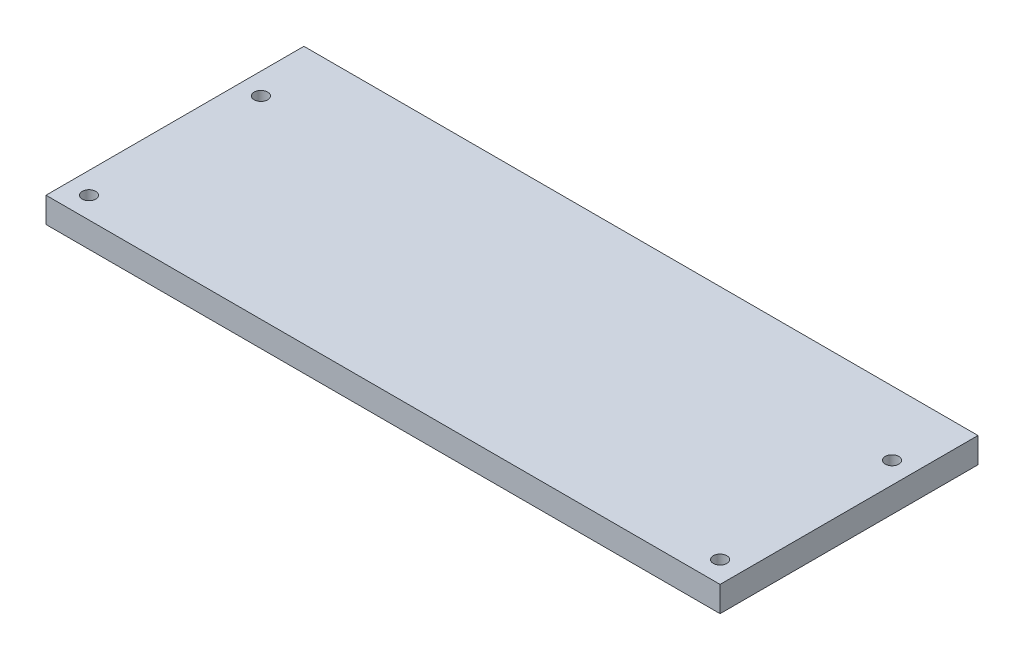
ISO-10303-21;
HEADER;
FILE_DESCRIPTION(('STEP AP214'),'2;1');
FILE_NAME('part.step','',(''),(''),'','','');
FILE_SCHEMA(('AUTOMOTIVE_DESIGN { 1 0 10303 214 1 1 1 1 }'));
ENDSEC;
DATA;
#1=APPLICATION_CONTEXT('core data for automotive mechanical design processes');
#2=APPLICATION_PROTOCOL_DEFINITION('international standard','automotive_design',2000,#1);
#3=PRODUCT_CONTEXT('',#1,'mechanical');
#4=PRODUCT('Part','Part','',(#3));
#5=PRODUCT_RELATED_PRODUCT_CATEGORY('part','',(#4));
#6=PRODUCT_DEFINITION_FORMATION('','',#4);
#7=PRODUCT_DEFINITION_CONTEXT('part definition',#1,'design');
#8=PRODUCT_DEFINITION('design','',#6,#7);
#9=PRODUCT_DEFINITION_SHAPE('','',#8);
#10=(LENGTH_UNIT() NAMED_UNIT(*) SI_UNIT(.MILLI.,.METRE.));
#11=(NAMED_UNIT(*) PLANE_ANGLE_UNIT() SI_UNIT($,.RADIAN.));
#12=(NAMED_UNIT(*) SI_UNIT($,.STERADIAN.) SOLID_ANGLE_UNIT());
#13=UNCERTAINTY_MEASURE_WITH_UNIT(LENGTH_MEASURE(1.E-05),#10,'distance_accuracy_value','');
#14=(GEOMETRIC_REPRESENTATION_CONTEXT(3) GLOBAL_UNCERTAINTY_ASSIGNED_CONTEXT((#13)) GLOBAL_UNIT_ASSIGNED_CONTEXT((#10,
#11,#12)) REPRESENTATION_CONTEXT('',''));
#15=CARTESIAN_POINT('',(0.,0.,0.));
#16=DIRECTION('',(0.,0.,1.));
#17=DIRECTION('',(1.,0.,0.));
#18=AXIS2_PLACEMENT_3D('',#15,#16,#17);
#19=CARTESIAN_POINT('',(0.,15.,0.));
#20=DIRECTION('',(0.,-1.,0.));
#21=DIRECTION('',(0.,0.,-1.));
#22=AXIS2_PLACEMENT_3D('',#19,#20,#21);
#23=PLANE('',#22);
#24=DIRECTION('',(0.,0.,1.));
#25=VECTOR('',#24,1.);
#26=CARTESIAN_POINT('',(0.,15.,0.));
#27=LINE('',#26,#25);
#28=CARTESIAN_POINT('',(0.,15.,-152.4));
#29=VERTEX_POINT('',#28);
#30=CARTESIAN_POINT('',(0.,15.,0.));
#31=VERTEX_POINT('',#30);
#32=EDGE_CURVE('E85',#29,#31,#27,.T.);
#33=ORIENTED_EDGE('',*,*,#32,.T.);
#34=DIRECTION('',(1.,0.,0.));
#35=VECTOR('',#34,1.);
#36=CARTESIAN_POINT('',(0.,15.,0.));
#37=LINE('',#36,#35);
#38=CARTESIAN_POINT('',(398.3,15.,0.));
#39=VERTEX_POINT('',#38);
#40=EDGE_CURVE('E80',#31,#39,#37,.T.);
#41=ORIENTED_EDGE('',*,*,#40,.T.);
#42=DIRECTION('',(0.,0.,-1.));
#43=VECTOR('',#42,1.);
#44=CARTESIAN_POINT('',(398.3,15.,0.));
#45=LINE('',#44,#43);
#46=CARTESIAN_POINT('',(398.3,15.,-152.4));
#47=VERTEX_POINT('',#46);
#48=EDGE_CURVE('E83',#39,#47,#45,.T.);
#49=ORIENTED_EDGE('',*,*,#48,.T.);
#50=DIRECTION('',(-1.,0.,0.));
#51=VECTOR('',#50,1.);
#52=CARTESIAN_POINT('',(0.,15.,-152.4));
#53=LINE('',#52,#51);
#54=EDGE_CURVE('E50',#47,#29,#53,.T.);
#55=ORIENTED_EDGE('',*,*,#54,.T.);
#56=EDGE_LOOP('',(#33,#41,#49,#55));
#57=FACE_BOUND('',#56,.T.);
#58=CARTESIAN_POINT('',(12.7,15.,-114.3));
#59=DIRECTION('',(0.,1.,0.));
#60=DIRECTION('',(0.,0.,1.));
#61=AXIS2_PLACEMENT_3D('',#58,#59,#60);
#62=CIRCLE('',#61,4.);
#63=CARTESIAN_POINT('',(12.7,15.,-110.3));
#64=VERTEX_POINT('',#63);
#65=EDGE_CURVE('E100',#64,#64,#62,.T.);
#66=ORIENTED_EDGE('',*,*,#65,.F.);
#67=EDGE_LOOP('',(#66));
#68=FACE_BOUND('',#67,.T.);
#69=CARTESIAN_POINT('',(12.7,15.,-12.7));
#70=DIRECTION('',(0.,1.,0.));
#71=DIRECTION('',(0.,0.,1.));
#72=AXIS2_PLACEMENT_3D('',#69,#70,#71);
#73=CIRCLE('',#72,4.);
#74=CARTESIAN_POINT('',(12.7,15.,-8.69999999999996));
#75=VERTEX_POINT('',#74);
#76=EDGE_CURVE('E115',#75,#75,#73,.T.);
#77=ORIENTED_EDGE('',*,*,#76,.F.);
#78=EDGE_LOOP('',(#77));
#79=FACE_BOUND('',#78,.T.);
#80=CARTESIAN_POINT('',(385.6,15.,-114.3));
#81=DIRECTION('',(0.,1.,0.));
#82=DIRECTION('',(0.,0.,1.));
#83=AXIS2_PLACEMENT_3D('',#80,#81,#82);
#84=CIRCLE('',#83,3.99999999999999);
#85=CARTESIAN_POINT('',(385.6,15.,-110.3));
#86=VERTEX_POINT('',#85);
#87=EDGE_CURVE('E121',#86,#86,#84,.T.);
#88=ORIENTED_EDGE('',*,*,#87,.F.);
#89=EDGE_LOOP('',(#88));
#90=FACE_BOUND('',#89,.T.);
#91=CARTESIAN_POINT('',(385.6,15.,-12.7));
#92=DIRECTION('',(0.,1.,0.));
#93=DIRECTION('',(0.,0.,1.));
#94=AXIS2_PLACEMENT_3D('',#91,#92,#93);
#95=CIRCLE('',#94,3.99999999999999);
#96=CARTESIAN_POINT('',(385.6,15.,-8.70000000000002));
#97=VERTEX_POINT('',#96);
#98=EDGE_CURVE('E127',#97,#97,#95,.T.);
#99=ORIENTED_EDGE('',*,*,#98,.F.);
#100=EDGE_LOOP('',(#99));
#101=FACE_BOUND('',#100,.T.);
#102=ADVANCED_FACE('F33',(#57,#68,#79,#90,#101),#23,.F.);
#103=CARTESIAN_POINT('',(0.,0.,0.));
#104=DIRECTION('',(0.,-1.,0.));
#105=DIRECTION('',(0.,0.,-1.));
#106=AXIS2_PLACEMENT_3D('',#103,#104,#105);
#107=PLANE('',#106);
#108=CARTESIAN_POINT('',(385.6,0.,-114.3));
#109=DIRECTION('',(0.,1.,0.));
#110=DIRECTION('',(0.,0.,1.));
#111=AXIS2_PLACEMENT_3D('',#108,#109,#110);
#112=CIRCLE('',#111,3.99999999999999);
#113=CARTESIAN_POINT('',(385.6,0.,-110.3));
#114=VERTEX_POINT('',#113);
#115=EDGE_CURVE('E124',#114,#114,#112,.T.);
#116=ORIENTED_EDGE('',*,*,#115,.T.);
#117=EDGE_LOOP('',(#116));
#118=FACE_BOUND('',#117,.T.);
#119=CARTESIAN_POINT('',(12.7,0.,-114.3));
#120=DIRECTION('',(0.,1.,0.));
#121=DIRECTION('',(0.,0.,1.));
#122=AXIS2_PLACEMENT_3D('',#119,#120,#121);
#123=CIRCLE('',#122,4.);
#124=CARTESIAN_POINT('',(12.7,0.,-110.3));
#125=VERTEX_POINT('',#124);
#126=EDGE_CURVE('E112',#125,#125,#123,.T.);
#127=ORIENTED_EDGE('',*,*,#126,.T.);
#128=EDGE_LOOP('',(#127));
#129=FACE_BOUND('',#128,.T.);
#130=DIRECTION('',(0.,0.,1.));
#131=VECTOR('',#130,1.);
#132=CARTESIAN_POINT('',(0.,0.,0.));
#133=LINE('',#132,#131);
#134=CARTESIAN_POINT('',(0.,0.,-152.4));
#135=VERTEX_POINT('',#134);
#136=CARTESIAN_POINT('',(0.,0.,0.));
#137=VERTEX_POINT('',#136);
#138=EDGE_CURVE('E97',#135,#137,#133,.T.);
#139=ORIENTED_EDGE('',*,*,#138,.F.);
#140=DIRECTION('',(-1.,0.,0.));
#141=VECTOR('',#140,1.);
#142=CARTESIAN_POINT('',(0.,0.,-152.4));
#143=LINE('',#142,#141);
#144=CARTESIAN_POINT('',(398.3,0.,-152.4));
#145=VERTEX_POINT('',#144);
#146=EDGE_CURVE('E73',#145,#135,#143,.T.);
#147=ORIENTED_EDGE('',*,*,#146,.F.);
#148=DIRECTION('',(0.,0.,-1.));
#149=VECTOR('',#148,1.);
#150=CARTESIAN_POINT('',(398.3,0.,0.));
#151=LINE('',#150,#149);
#152=CARTESIAN_POINT('',(398.3,0.,0.));
#153=VERTEX_POINT('',#152);
#154=EDGE_CURVE('E67',#153,#145,#151,.T.);
#155=ORIENTED_EDGE('',*,*,#154,.F.);
#156=DIRECTION('',(1.,0.,0.));
#157=VECTOR('',#156,1.);
#158=CARTESIAN_POINT('',(0.,0.,0.));
#159=LINE('',#158,#157);
#160=EDGE_CURVE('E89',#137,#153,#159,.T.);
#161=ORIENTED_EDGE('',*,*,#160,.F.);
#162=EDGE_LOOP('',(#139,#147,#155,#161));
#163=FACE_BOUND('',#162,.T.);
#164=CARTESIAN_POINT('',(12.7,0.,-12.7));
#165=DIRECTION('',(0.,1.,0.));
#166=DIRECTION('',(0.,0.,1.));
#167=AXIS2_PLACEMENT_3D('',#164,#165,#166);
#168=CIRCLE('',#167,4.);
#169=CARTESIAN_POINT('',(12.7,0.,-8.69999999999996));
#170=VERTEX_POINT('',#169);
#171=EDGE_CURVE('E118',#170,#170,#168,.T.);
#172=ORIENTED_EDGE('',*,*,#171,.T.);
#173=EDGE_LOOP('',(#172));
#174=FACE_BOUND('',#173,.T.);
#175=CARTESIAN_POINT('',(385.6,0.,-12.7));
#176=DIRECTION('',(0.,1.,0.));
#177=DIRECTION('',(0.,0.,1.));
#178=AXIS2_PLACEMENT_3D('',#175,#176,#177);
#179=CIRCLE('',#178,3.99999999999999);
#180=CARTESIAN_POINT('',(385.6,0.,-8.70000000000002));
#181=VERTEX_POINT('',#180);
#182=EDGE_CURVE('E130',#181,#181,#179,.T.);
#183=ORIENTED_EDGE('',*,*,#182,.T.);
#184=EDGE_LOOP('',(#183));
#185=FACE_BOUND('',#184,.T.);
#186=ADVANCED_FACE('F108',(#118,#129,#163,#174,#185),#107,.T.);
#187=CARTESIAN_POINT('',(0.,15.,0.));
#188=DIRECTION('',(1.,0.,0.));
#189=DIRECTION('',(0.,0.,-1.));
#190=AXIS2_PLACEMENT_3D('',#187,#188,#189);
#191=PLANE('',#190);
#192=ORIENTED_EDGE('',*,*,#138,.T.);
#193=DIRECTION('',(0.,-1.,0.));
#194=VECTOR('',#193,1.);
#195=CARTESIAN_POINT('',(0.,15.,0.));
#196=LINE('',#195,#194);
#197=EDGE_CURVE('E11',#31,#137,#196,.T.);
#198=ORIENTED_EDGE('',*,*,#197,.F.);
#199=ORIENTED_EDGE('',*,*,#32,.F.);
#200=DIRECTION('',(0.,-1.,0.));
#201=VECTOR('',#200,1.);
#202=CARTESIAN_POINT('',(0.,15.,-152.4));
#203=LINE('',#202,#201);
#204=EDGE_CURVE('E93',#29,#135,#203,.T.);
#205=ORIENTED_EDGE('',*,*,#204,.T.);
#206=EDGE_LOOP('',(#192,#198,#199,#205));
#207=FACE_BOUND('',#206,.T.);
#208=ADVANCED_FACE('F35',(#207),#191,.F.);
#209=CARTESIAN_POINT('',(0.,15.,0.));
#210=DIRECTION('',(0.,0.,-1.));
#211=DIRECTION('',(-1.,0.,0.));
#212=AXIS2_PLACEMENT_3D('',#209,#210,#211);
#213=PLANE('',#212);
#214=ORIENTED_EDGE('',*,*,#160,.T.);
#215=DIRECTION('',(0.,-1.,0.));
#216=VECTOR('',#215,1.);
#217=CARTESIAN_POINT('',(398.3,15.,0.));
#218=LINE('',#217,#216);
#219=EDGE_CURVE('E42',#39,#153,#218,.T.);
#220=ORIENTED_EDGE('',*,*,#219,.F.);
#221=ORIENTED_EDGE('',*,*,#40,.F.);
#222=ORIENTED_EDGE('',*,*,#197,.T.);
#223=EDGE_LOOP('',(#214,#220,#221,#222));
#224=FACE_BOUND('',#223,.T.);
#225=ADVANCED_FACE('F88',(#224),#213,.F.);
#226=CARTESIAN_POINT('',(398.3,15.,0.));
#227=DIRECTION('',(-1.,0.,0.));
#228=DIRECTION('',(0.,0.,1.));
#229=AXIS2_PLACEMENT_3D('',#226,#227,#228);
#230=PLANE('',#229);
#231=ORIENTED_EDGE('',*,*,#154,.T.);
#232=DIRECTION('',(0.,-1.,0.));
#233=VECTOR('',#232,1.);
#234=CARTESIAN_POINT('',(398.3,15.,-152.4));
#235=LINE('',#234,#233);
#236=EDGE_CURVE('E90',#47,#145,#235,.T.);
#237=ORIENTED_EDGE('',*,*,#236,.F.);
#238=ORIENTED_EDGE('',*,*,#48,.F.);
#239=ORIENTED_EDGE('',*,*,#219,.T.);
#240=EDGE_LOOP('',(#231,#237,#238,#239));
#241=FACE_BOUND('',#240,.T.);
#242=ADVANCED_FACE('F91',(#241),#230,.F.);
#243=CARTESIAN_POINT('',(0.,15.,-152.4));
#244=DIRECTION('',(0.,0.,1.));
#245=DIRECTION('',(1.,0.,0.));
#246=AXIS2_PLACEMENT_3D('',#243,#244,#245);
#247=PLANE('',#246);
#248=ORIENTED_EDGE('',*,*,#146,.T.);
#249=ORIENTED_EDGE('',*,*,#204,.F.);
#250=ORIENTED_EDGE('',*,*,#54,.F.);
#251=ORIENTED_EDGE('',*,*,#236,.T.);
#252=EDGE_LOOP('',(#248,#249,#250,#251));
#253=FACE_BOUND('',#252,.T.);
#254=ADVANCED_FACE('F105',(#253),#247,.F.);
#255=CARTESIAN_POINT('',(12.7,15.,-114.3));
#256=DIRECTION('',(0.,-1.,0.));
#257=DIRECTION('',(0.,0.,-1.));
#258=AXIS2_PLACEMENT_3D('',#255,#256,#257);
#259=CYLINDRICAL_SURFACE('',#258,4.);
#260=ORIENTED_EDGE('',*,*,#65,.T.);
#261=EDGE_LOOP('',(#260));
#262=FACE_BOUND('',#261,.T.);
#263=ORIENTED_EDGE('',*,*,#126,.F.);
#264=EDGE_LOOP('',(#263));
#265=FACE_BOUND('',#264,.T.);
#266=ADVANCED_FACE('F147',(#262,#265),#259,.F.);
#267=CARTESIAN_POINT('',(12.7,15.,-12.7));
#268=DIRECTION('',(0.,-1.,0.));
#269=DIRECTION('',(0.,0.,-1.));
#270=AXIS2_PLACEMENT_3D('',#267,#268,#269);
#271=CYLINDRICAL_SURFACE('',#270,4.);
#272=ORIENTED_EDGE('',*,*,#76,.T.);
#273=EDGE_LOOP('',(#272));
#274=FACE_BOUND('',#273,.T.);
#275=ORIENTED_EDGE('',*,*,#171,.F.);
#276=EDGE_LOOP('',(#275));
#277=FACE_BOUND('',#276,.T.);
#278=ADVANCED_FACE('F193',(#274,#277),#271,.F.);
#279=CARTESIAN_POINT('',(385.6,15.,-114.3));
#280=DIRECTION('',(0.,-1.,0.));
#281=DIRECTION('',(0.,0.,-1.));
#282=AXIS2_PLACEMENT_3D('',#279,#280,#281);
#283=CYLINDRICAL_SURFACE('',#282,3.99999999999999);
#284=ORIENTED_EDGE('',*,*,#87,.T.);
#285=EDGE_LOOP('',(#284));
#286=FACE_BOUND('',#285,.T.);
#287=ORIENTED_EDGE('',*,*,#115,.F.);
#288=EDGE_LOOP('',(#287));
#289=FACE_BOUND('',#288,.T.);
#290=ADVANCED_FACE('F201',(#286,#289),#283,.F.);
#291=CARTESIAN_POINT('',(385.6,15.,-12.7));
#292=DIRECTION('',(0.,-1.,0.));
#293=DIRECTION('',(0.,0.,-1.));
#294=AXIS2_PLACEMENT_3D('',#291,#292,#293);
#295=CYLINDRICAL_SURFACE('',#294,3.99999999999999);
#296=ORIENTED_EDGE('',*,*,#98,.T.);
#297=EDGE_LOOP('',(#296));
#298=FACE_BOUND('',#297,.T.);
#299=ORIENTED_EDGE('',*,*,#182,.F.);
#300=EDGE_LOOP('',(#299));
#301=FACE_BOUND('',#300,.T.);
#302=ADVANCED_FACE('F136',(#298,#301),#295,.F.);
#303=CLOSED_SHELL('',(#102,#186,#208,#225,#242,#254,#266,#278,#290,#302));
#304=MANIFOLD_SOLID_BREP('B2',#303);
#305=ADVANCED_BREP_SHAPE_REPRESENTATION('',(#18,#304),#14);
#306=SHAPE_DEFINITION_REPRESENTATION(#9,#305);
ENDSEC;
END-ISO-10303-21;
